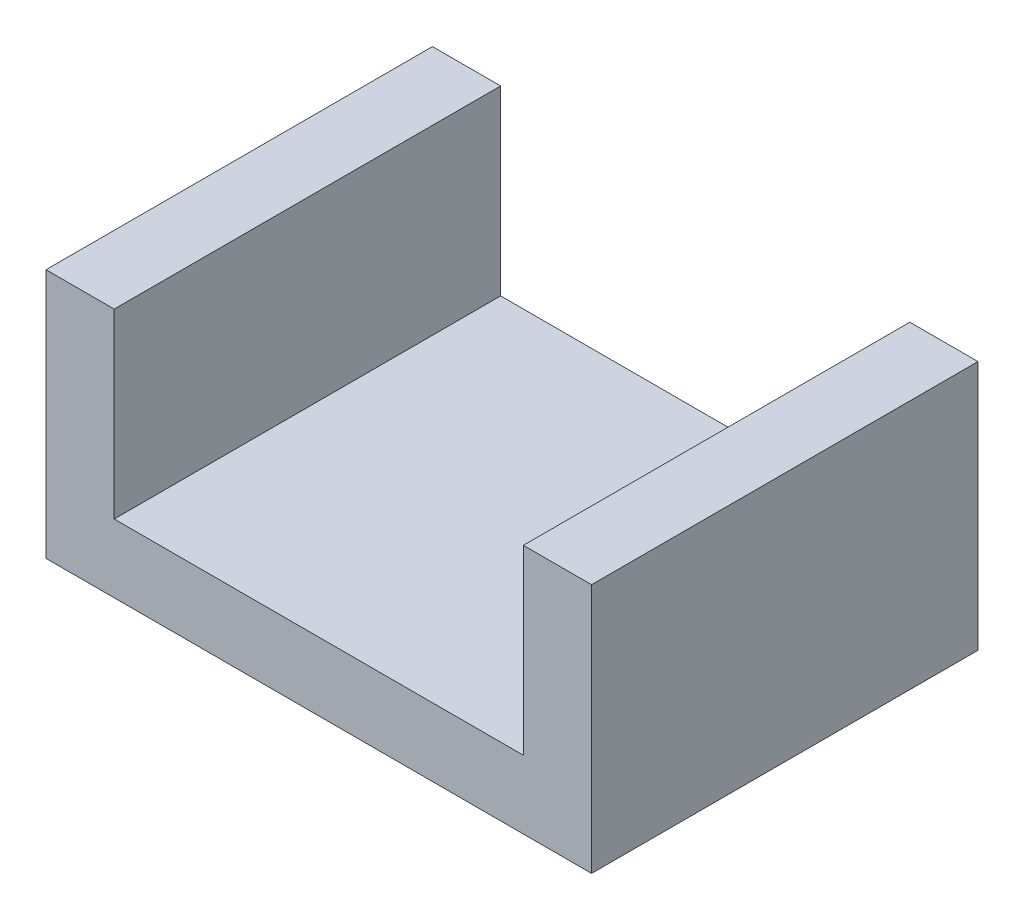
ISO-10303-21;
HEADER;
FILE_DESCRIPTION(('STEP AP214'),'2;1');
FILE_NAME('part.step','',(''),(''),'','','');
FILE_SCHEMA(('AUTOMOTIVE_DESIGN { 1 0 10303 214 1 1 1 1 }'));
ENDSEC;
DATA;
#1=APPLICATION_CONTEXT('core data for automotive mechanical design processes');
#2=APPLICATION_PROTOCOL_DEFINITION('international standard','automotive_design',2000,#1);
#3=PRODUCT_CONTEXT('',#1,'mechanical');
#4=PRODUCT('Part','Part','',(#3));
#5=PRODUCT_RELATED_PRODUCT_CATEGORY('part','',(#4));
#6=PRODUCT_DEFINITION_FORMATION('','',#4);
#7=PRODUCT_DEFINITION_CONTEXT('part definition',#1,'design');
#8=PRODUCT_DEFINITION('design','',#6,#7);
#9=PRODUCT_DEFINITION_SHAPE('','',#8);
#10=(LENGTH_UNIT() NAMED_UNIT(*) SI_UNIT(.MILLI.,.METRE.));
#11=(NAMED_UNIT(*) PLANE_ANGLE_UNIT() SI_UNIT($,.RADIAN.));
#12=(NAMED_UNIT(*) SI_UNIT($,.STERADIAN.) SOLID_ANGLE_UNIT());
#13=UNCERTAINTY_MEASURE_WITH_UNIT(LENGTH_MEASURE(1.E-05),#10,'distance_accuracy_value','');
#14=(GEOMETRIC_REPRESENTATION_CONTEXT(3) GLOBAL_UNCERTAINTY_ASSIGNED_CONTEXT((#13)) GLOBAL_UNIT_ASSIGNED_CONTEXT((#10,
#11,#12)) REPRESENTATION_CONTEXT('',''));
#15=CARTESIAN_POINT('',(0.,0.,0.));
#16=DIRECTION('',(0.,0.,1.));
#17=DIRECTION('',(1.,0.,0.));
#18=AXIS2_PLACEMENT_3D('',#15,#16,#17);
#19=CARTESIAN_POINT('',(-12.9954303105651,-3.00186333820094,-17.));
#20=DIRECTION('',(0.,-1.,0.));
#21=DIRECTION('',(1.,0.,0.));
#22=AXIS2_PLACEMENT_3D('',#19,#20,#21);
#23=PLANE('',#22);
#24=DIRECTION('',(1.,0.,0.));
#25=VECTOR('',#24,1.);
#26=CARTESIAN_POINT('',(-12.9954303105651,-3.00186333820094,0.));
#27=LINE('',#26,#25);
#28=CARTESIAN_POINT('',(-12.9954303105651,-3.00186333820094,0.));
#29=VERTEX_POINT('',#28);
#30=CARTESIAN_POINT('',(11.0045696894349,-3.00186333820093,0.));
#31=VERTEX_POINT('',#30);
#32=EDGE_CURVE('E129',#29,#31,#27,.T.);
#33=ORIENTED_EDGE('',*,*,#32,.F.);
#34=DIRECTION('',(0.,0.,1.));
#35=VECTOR('',#34,1.);
#36=CARTESIAN_POINT('',(-12.9954303105651,-3.00186333820094,-17.));
#37=LINE('',#36,#35);
#38=CARTESIAN_POINT('',(-12.9954303105651,-3.00186333820094,-17.));
#39=VERTEX_POINT('',#38);
#40=EDGE_CURVE('E11',#39,#29,#37,.T.);
#41=ORIENTED_EDGE('',*,*,#40,.F.);
#42=DIRECTION('',(1.,0.,0.));
#43=VECTOR('',#42,1.);
#44=CARTESIAN_POINT('',(-12.9954303105651,-3.00186333820094,-17.));
#45=LINE('',#44,#43);
#46=CARTESIAN_POINT('',(11.0045696894349,-3.00186333820093,-17.));
#47=VERTEX_POINT('',#46);
#48=EDGE_CURVE('E149',#39,#47,#45,.T.);
#49=ORIENTED_EDGE('',*,*,#48,.T.);
#50=DIRECTION('',(0.,0.,1.));
#51=VECTOR('',#50,1.);
#52=CARTESIAN_POINT('',(11.0045696894349,-3.00186333820093,-17.));
#53=LINE('',#52,#51);
#54=EDGE_CURVE('E35',#47,#31,#53,.T.);
#55=ORIENTED_EDGE('',*,*,#54,.T.);
#56=EDGE_LOOP('',(#33,#41,#49,#55));
#57=FACE_BOUND('',#56,.T.);
#58=ADVANCED_FACE('F32',(#57),#23,.T.);
#59=CARTESIAN_POINT('',(-12.9954303105651,7.99813666179907,-17.));
#60=DIRECTION('',(-1.,0.,0.));
#61=DIRECTION('',(0.,-1.,0.));
#62=AXIS2_PLACEMENT_3D('',#59,#60,#61);
#63=PLANE('',#62);
#64=DIRECTION('',(0.,-1.,0.));
#65=VECTOR('',#64,1.);
#66=CARTESIAN_POINT('',(-12.9954303105651,7.99813666179907,0.));
#67=LINE('',#66,#65);
#68=CARTESIAN_POINT('',(-12.9954303105651,7.99813666179907,0.));
#69=VERTEX_POINT('',#68);
#70=EDGE_CURVE('E147',#69,#29,#67,.T.);
#71=ORIENTED_EDGE('',*,*,#70,.F.);
#72=DIRECTION('',(0.,0.,1.));
#73=VECTOR('',#72,1.);
#74=CARTESIAN_POINT('',(-12.9954303105651,7.99813666179907,-17.));
#75=LINE('',#74,#73);
#76=CARTESIAN_POINT('',(-12.9954303105651,7.99813666179907,-17.));
#77=VERTEX_POINT('',#76);
#78=EDGE_CURVE('E41',#77,#69,#75,.T.);
#79=ORIENTED_EDGE('',*,*,#78,.F.);
#80=DIRECTION('',(0.,-1.,0.));
#81=VECTOR('',#80,1.);
#82=CARTESIAN_POINT('',(-12.9954303105651,7.99813666179907,-17.));
#83=LINE('',#82,#81);
#84=EDGE_CURVE('E119',#77,#39,#83,.T.);
#85=ORIENTED_EDGE('',*,*,#84,.T.);
#86=ORIENTED_EDGE('',*,*,#40,.T.);
#87=EDGE_LOOP('',(#71,#79,#85,#86));
#88=FACE_BOUND('',#87,.T.);
#89=ADVANCED_FACE('F161',(#88),#63,.T.);
#90=CARTESIAN_POINT('',(-9.99543031056509,7.99813666179907,-17.));
#91=DIRECTION('',(0.,1.,0.));
#92=DIRECTION('',(0.,0.,1.));
#93=AXIS2_PLACEMENT_3D('',#90,#91,#92);
#94=PLANE('',#93);
#95=DIRECTION('',(-1.,0.,0.));
#96=VECTOR('',#95,1.);
#97=CARTESIAN_POINT('',(-9.99543031056509,7.99813666179907,0.));
#98=LINE('',#97,#96);
#99=CARTESIAN_POINT('',(-9.99543031056509,7.99813666179907,0.));
#100=VERTEX_POINT('',#99);
#101=EDGE_CURVE('E106',#100,#69,#98,.T.);
#102=ORIENTED_EDGE('',*,*,#101,.F.);
#103=DIRECTION('',(0.,0.,1.));
#104=VECTOR('',#103,1.);
#105=CARTESIAN_POINT('',(-9.99543031056509,7.99813666179907,-17.));
#106=LINE('',#105,#104);
#107=CARTESIAN_POINT('',(-9.99543031056509,7.99813666179907,-17.));
#108=VERTEX_POINT('',#107);
#109=EDGE_CURVE('E101',#108,#100,#106,.T.);
#110=ORIENTED_EDGE('',*,*,#109,.F.);
#111=DIRECTION('',(-1.,0.,0.));
#112=VECTOR('',#111,1.);
#113=CARTESIAN_POINT('',(-9.99543031056509,7.99813666179907,-17.));
#114=LINE('',#113,#112);
#115=EDGE_CURVE('E104',#108,#77,#114,.T.);
#116=ORIENTED_EDGE('',*,*,#115,.T.);
#117=ORIENTED_EDGE('',*,*,#78,.T.);
#118=EDGE_LOOP('',(#102,#110,#116,#117));
#119=FACE_BOUND('',#118,.T.);
#120=ADVANCED_FACE('F103',(#119),#94,.T.);
#121=CARTESIAN_POINT('',(-9.99543031056509,0.,-17.));
#122=DIRECTION('',(1.,0.,0.));
#123=DIRECTION('',(0.,0.,-1.));
#124=AXIS2_PLACEMENT_3D('',#121,#122,#123);
#125=PLANE('',#124);
#126=DIRECTION('',(0.,1.,0.));
#127=VECTOR('',#126,1.);
#128=CARTESIAN_POINT('',(-9.99543031056509,0.,0.));
#129=LINE('',#128,#127);
#130=CARTESIAN_POINT('',(-9.99543031056509,0.,0.));
#131=VERTEX_POINT('',#130);
#132=EDGE_CURVE('E144',#131,#100,#129,.T.);
#133=ORIENTED_EDGE('',*,*,#132,.F.);
#134=DIRECTION('',(0.,0.,1.));
#135=VECTOR('',#134,1.);
#136=CARTESIAN_POINT('',(-9.99543031056509,0.,-17.));
#137=LINE('',#136,#135);
#138=CARTESIAN_POINT('',(-9.99543031056509,0.,-17.));
#139=VERTEX_POINT('',#138);
#140=EDGE_CURVE('E111',#139,#131,#137,.T.);
#141=ORIENTED_EDGE('',*,*,#140,.F.);
#142=DIRECTION('',(0.,1.,0.));
#143=VECTOR('',#142,1.);
#144=CARTESIAN_POINT('',(-9.99543031056509,0.,-17.));
#145=LINE('',#144,#143);
#146=EDGE_CURVE('E117',#139,#108,#145,.T.);
#147=ORIENTED_EDGE('',*,*,#146,.T.);
#148=ORIENTED_EDGE('',*,*,#109,.T.);
#149=EDGE_LOOP('',(#133,#141,#147,#148));
#150=FACE_BOUND('',#149,.T.);
#151=ADVANCED_FACE('F121',(#150),#125,.T.);
#152=CARTESIAN_POINT('',(-9.99543031056509,0.,-17.));
#153=DIRECTION('',(0.,1.,0.));
#154=DIRECTION('',(0.,0.,1.));
#155=AXIS2_PLACEMENT_3D('',#152,#153,#154);
#156=PLANE('',#155);
#157=DIRECTION('',(-1.,0.,0.));
#158=VECTOR('',#157,1.);
#159=CARTESIAN_POINT('',(-9.99543031056509,0.,0.));
#160=LINE('',#159,#158);
#161=CARTESIAN_POINT('',(8.00456968943491,0.,0.));
#162=VERTEX_POINT('',#161);
#163=EDGE_CURVE('E141',#162,#131,#160,.T.);
#164=ORIENTED_EDGE('',*,*,#163,.F.);
#165=DIRECTION('',(0.,0.,1.));
#166=VECTOR('',#165,1.);
#167=CARTESIAN_POINT('',(8.00456968943491,0.,-17.));
#168=LINE('',#167,#166);
#169=CARTESIAN_POINT('',(8.00456968943491,0.,-17.));
#170=VERTEX_POINT('',#169);
#171=EDGE_CURVE('E153',#170,#162,#168,.T.);
#172=ORIENTED_EDGE('',*,*,#171,.F.);
#173=DIRECTION('',(-1.,0.,0.));
#174=VECTOR('',#173,1.);
#175=CARTESIAN_POINT('',(-9.99543031056509,0.,-17.));
#176=LINE('',#175,#174);
#177=EDGE_CURVE('E122',#170,#139,#176,.T.);
#178=ORIENTED_EDGE('',*,*,#177,.T.);
#179=ORIENTED_EDGE('',*,*,#140,.T.);
#180=EDGE_LOOP('',(#164,#172,#178,#179));
#181=FACE_BOUND('',#180,.T.);
#182=ADVANCED_FACE('F174',(#181),#156,.T.);
#183=CARTESIAN_POINT('',(8.00456968943491,0.,-17.));
#184=DIRECTION('',(-1.,0.,0.));
#185=DIRECTION('',(0.,0.,1.));
#186=AXIS2_PLACEMENT_3D('',#183,#184,#185);
#187=PLANE('',#186);
#188=DIRECTION('',(0.,-1.,0.));
#189=VECTOR('',#188,1.);
#190=CARTESIAN_POINT('',(8.00456968943491,0.,0.));
#191=LINE('',#190,#189);
#192=CARTESIAN_POINT('',(8.00456968943491,7.99813666179907,0.));
#193=VERTEX_POINT('',#192);
#194=EDGE_CURVE('E138',#193,#162,#191,.T.);
#195=ORIENTED_EDGE('',*,*,#194,.F.);
#196=DIRECTION('',(0.,0.,1.));
#197=VECTOR('',#196,1.);
#198=CARTESIAN_POINT('',(8.00456968943491,7.99813666179907,-17.));
#199=LINE('',#198,#197);
#200=CARTESIAN_POINT('',(8.00456968943491,7.99813666179907,-17.));
#201=VERTEX_POINT('',#200);
#202=EDGE_CURVE('E155',#201,#193,#199,.T.);
#203=ORIENTED_EDGE('',*,*,#202,.F.);
#204=DIRECTION('',(0.,-1.,0.));
#205=VECTOR('',#204,1.);
#206=CARTESIAN_POINT('',(8.00456968943491,0.,-17.));
#207=LINE('',#206,#205);
#208=EDGE_CURVE('E124',#201,#170,#207,.T.);
#209=ORIENTED_EDGE('',*,*,#208,.T.);
#210=ORIENTED_EDGE('',*,*,#171,.T.);
#211=EDGE_LOOP('',(#195,#203,#209,#210));
#212=FACE_BOUND('',#211,.T.);
#213=ADVANCED_FACE('F177',(#212),#187,.T.);
#214=CARTESIAN_POINT('',(8.00456968943491,7.99813666179907,-17.));
#215=DIRECTION('',(0.,1.,0.));
#216=DIRECTION('',(0.,0.,1.));
#217=AXIS2_PLACEMENT_3D('',#214,#215,#216);
#218=PLANE('',#217);
#219=DIRECTION('',(-1.,0.,0.));
#220=VECTOR('',#219,1.);
#221=CARTESIAN_POINT('',(8.00456968943491,7.99813666179907,0.));
#222=LINE('',#221,#220);
#223=CARTESIAN_POINT('',(11.0045696894349,7.99813666179907,0.));
#224=VERTEX_POINT('',#223);
#225=EDGE_CURVE('E135',#224,#193,#222,.T.);
#226=ORIENTED_EDGE('',*,*,#225,.F.);
#227=DIRECTION('',(0.,0.,1.));
#228=VECTOR('',#227,1.);
#229=CARTESIAN_POINT('',(11.0045696894349,7.99813666179907,-17.));
#230=LINE('',#229,#228);
#231=CARTESIAN_POINT('',(11.0045696894349,7.99813666179907,-17.));
#232=VERTEX_POINT('',#231);
#233=EDGE_CURVE('E156',#232,#224,#230,.T.);
#234=ORIENTED_EDGE('',*,*,#233,.F.);
#235=DIRECTION('',(-1.,0.,0.));
#236=VECTOR('',#235,1.);
#237=CARTESIAN_POINT('',(8.00456968943491,7.99813666179907,-17.));
#238=LINE('',#237,#236);
#239=EDGE_CURVE('E252',#232,#201,#238,.T.);
#240=ORIENTED_EDGE('',*,*,#239,.T.);
#241=ORIENTED_EDGE('',*,*,#202,.T.);
#242=EDGE_LOOP('',(#226,#234,#240,#241));
#243=FACE_BOUND('',#242,.T.);
#244=ADVANCED_FACE('F181',(#243),#218,.T.);
#245=CARTESIAN_POINT('',(11.0045696894349,7.99813666179907,-17.));
#246=DIRECTION('',(1.,0.,0.));
#247=DIRECTION('',(0.,1.,0.));
#248=AXIS2_PLACEMENT_3D('',#245,#246,#247);
#249=PLANE('',#248);
#250=DIRECTION('',(0.,1.,0.));
#251=VECTOR('',#250,1.);
#252=CARTESIAN_POINT('',(11.0045696894349,7.99813666179907,0.));
#253=LINE('',#252,#251);
#254=EDGE_CURVE('E132',#31,#224,#253,.T.);
#255=ORIENTED_EDGE('',*,*,#254,.F.);
#256=ORIENTED_EDGE('',*,*,#54,.F.);
#257=DIRECTION('',(0.,1.,0.));
#258=VECTOR('',#257,1.);
#259=CARTESIAN_POINT('',(11.0045696894349,7.99813666179907,-17.));
#260=LINE('',#259,#258);
#261=EDGE_CURVE('E253',#47,#232,#260,.T.);
#262=ORIENTED_EDGE('',*,*,#261,.T.);
#263=ORIENTED_EDGE('',*,*,#233,.T.);
#264=EDGE_LOOP('',(#255,#256,#262,#263));
#265=FACE_BOUND('',#264,.T.);
#266=ADVANCED_FACE('F158',(#265),#249,.T.);
#267=CARTESIAN_POINT('',(0.,0.,-17.));
#268=DIRECTION('',(0.,0.,-1.));
#269=DIRECTION('',(-1.,0.,0.));
#270=AXIS2_PLACEMENT_3D('',#267,#268,#269);
#271=PLANE('',#270);
#272=ORIENTED_EDGE('',*,*,#48,.F.);
#273=ORIENTED_EDGE('',*,*,#84,.F.);
#274=ORIENTED_EDGE('',*,*,#115,.F.);
#275=ORIENTED_EDGE('',*,*,#146,.F.);
#276=ORIENTED_EDGE('',*,*,#177,.F.);
#277=ORIENTED_EDGE('',*,*,#208,.F.);
#278=ORIENTED_EDGE('',*,*,#239,.F.);
#279=ORIENTED_EDGE('',*,*,#261,.F.);
#280=EDGE_LOOP('',(#272,#273,#274,#275,#276,#277,#278,#279));
#281=FACE_BOUND('',#280,.T.);
#282=ADVANCED_FACE('F115',(#281),#271,.T.);
#283=CARTESIAN_POINT('',(0.,0.,0.));
#284=DIRECTION('',(0.,0.,-1.));
#285=DIRECTION('',(-1.,0.,0.));
#286=AXIS2_PLACEMENT_3D('',#283,#284,#285);
#287=PLANE('',#286);
#288=ORIENTED_EDGE('',*,*,#32,.T.);
#289=ORIENTED_EDGE('',*,*,#254,.T.);
#290=ORIENTED_EDGE('',*,*,#225,.T.);
#291=ORIENTED_EDGE('',*,*,#194,.T.);
#292=ORIENTED_EDGE('',*,*,#163,.T.);
#293=ORIENTED_EDGE('',*,*,#132,.T.);
#294=ORIENTED_EDGE('',*,*,#101,.T.);
#295=ORIENTED_EDGE('',*,*,#70,.T.);
#296=EDGE_LOOP('',(#288,#289,#290,#291,#292,#293,#294,#295));
#297=FACE_BOUND('',#296,.T.);
#298=ADVANCED_FACE('F160',(#297),#287,.F.);
#299=CLOSED_SHELL('',(#58,#89,#120,#151,#182,#213,#244,#266,#282,#298));
#300=MANIFOLD_SOLID_BREP('B2',#299);
#301=ADVANCED_BREP_SHAPE_REPRESENTATION('',(#18,#300),#14);
#302=SHAPE_DEFINITION_REPRESENTATION(#9,#301);
ENDSEC;
END-ISO-10303-21;
